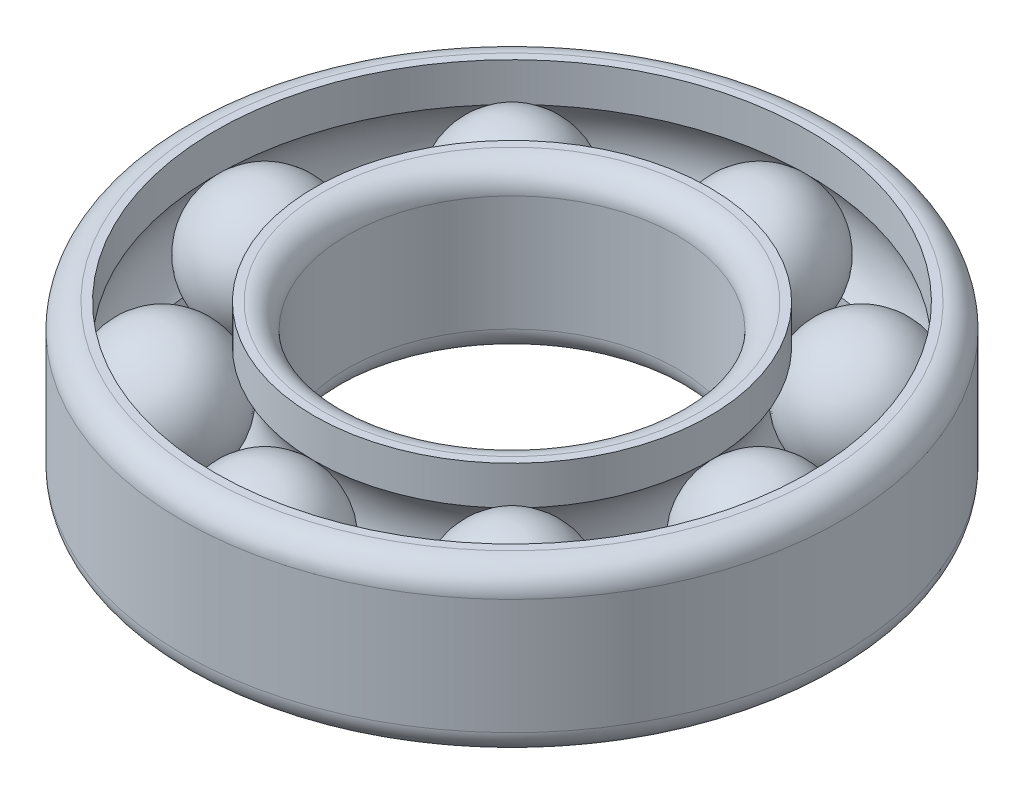
ISO-10303-21;
HEADER;
FILE_DESCRIPTION(('STEP AP214'),'2;1');
FILE_NAME('part.step','',(''),(''),'','','');
FILE_SCHEMA(('AUTOMOTIVE_DESIGN { 1 0 10303 214 1 1 1 1 }'));
ENDSEC;
DATA;
#1=APPLICATION_CONTEXT('core data for automotive mechanical design processes');
#2=APPLICATION_PROTOCOL_DEFINITION('international standard','automotive_design',2000,#1);
#3=PRODUCT_CONTEXT('',#1,'mechanical');
#4=PRODUCT('Part','Part','',(#3));
#5=PRODUCT_RELATED_PRODUCT_CATEGORY('part','',(#4));
#6=PRODUCT_DEFINITION_FORMATION('','',#4);
#7=PRODUCT_DEFINITION_CONTEXT('part definition',#1,'design');
#8=PRODUCT_DEFINITION('design','',#6,#7);
#9=PRODUCT_DEFINITION_SHAPE('','',#8);
#10=(LENGTH_UNIT() NAMED_UNIT(*) SI_UNIT(.MILLI.,.METRE.));
#11=(NAMED_UNIT(*) PLANE_ANGLE_UNIT() SI_UNIT($,.RADIAN.));
#12=(NAMED_UNIT(*) SI_UNIT($,.STERADIAN.) SOLID_ANGLE_UNIT());
#13=UNCERTAINTY_MEASURE_WITH_UNIT(LENGTH_MEASURE(1.E-05),#10,'distance_accuracy_value','');
#14=(GEOMETRIC_REPRESENTATION_CONTEXT(3) GLOBAL_UNCERTAINTY_ASSIGNED_CONTEXT((#13)) GLOBAL_UNIT_ASSIGNED_CONTEXT((#10,
#11,#12)) REPRESENTATION_CONTEXT('',''));
#15=CARTESIAN_POINT('',(0.,0.,0.));
#16=DIRECTION('',(0.,0.,1.));
#17=DIRECTION('',(1.,0.,0.));
#18=AXIS2_PLACEMENT_3D('',#15,#16,#17);
#19=CARTESIAN_POINT('',(-1.06066017177983,0.,1.06066017177981));
#20=DIRECTION('',(0.,1.,0.));
#21=DIRECTION('',(0.707106781186556,0.,-0.707106781186539));
#22=AXIS2_PLACEMENT_3D('',#19,#20,#21);
#23=SPHERICAL_SURFACE('',#22,0.4);
#24=CARTESIAN_POINT('',(-1.06066017177983,0.4,1.06066017177981));
#25=VERTEX_POINT('',#24);
#26=VERTEX_LOOP('',#25);
#27=FACE_BOUND('',#26,.T.);
#28=ADVANCED_FACE('F50',(#27),#23,.T.);
#29=CLOSED_SHELL('',(#28));
#30=MANIFOLD_SOLID_BREP('B2',#29);
#31=CARTESIAN_POINT('',(0.,0.,1.5));
#32=DIRECTION('',(0.,1.,0.));
#33=DIRECTION('',(0.,0.,-1.));
#34=AXIS2_PLACEMENT_3D('',#31,#32,#33);
#35=SPHERICAL_SURFACE('',#34,0.4);
#36=CARTESIAN_POINT('',(0.,0.4,1.5));
#37=VERTEX_POINT('',#36);
#38=VERTEX_LOOP('',#37);
#39=FACE_BOUND('',#38,.T.);
#40=ADVANCED_FACE('F72',(#39),#35,.T.);
#41=CLOSED_SHELL('',(#40));
#42=MANIFOLD_SOLID_BREP('B6',#41);
#43=CARTESIAN_POINT('',(1.06066017177981,0.,1.06066017177983));
#44=DIRECTION('',(0.,1.,0.));
#45=DIRECTION('',(-0.707106781186541,0.,-0.707106781186554));
#46=AXIS2_PLACEMENT_3D('',#43,#44,#45);
#47=SPHERICAL_SURFACE('',#46,0.4);
#48=CARTESIAN_POINT('',(1.06066017177981,0.4,1.06066017177983));
#49=VERTEX_POINT('',#48);
#50=VERTEX_LOOP('',#49);
#51=FACE_BOUND('',#50,.T.);
#52=ADVANCED_FACE('F94',(#51),#47,.T.);
#53=CLOSED_SHELL('',(#52));
#54=MANIFOLD_SOLID_BREP('B46',#53);
#55=CARTESIAN_POINT('',(1.5,0.,0.));
#56=DIRECTION('',(0.,1.,0.));
#57=DIRECTION('',(-1.,0.,0.));
#58=AXIS2_PLACEMENT_3D('',#55,#56,#57);
#59=SPHERICAL_SURFACE('',#58,0.4);
#60=CARTESIAN_POINT('',(1.5,0.4,0.));
#61=VERTEX_POINT('',#60);
#62=VERTEX_LOOP('',#61);
#63=FACE_BOUND('',#62,.T.);
#64=ADVANCED_FACE('F116',(#63),#59,.T.);
#65=CLOSED_SHELL('',(#64));
#66=MANIFOLD_SOLID_BREP('B68',#65);
#67=CARTESIAN_POINT('',(1.06066017177983,0.,-1.06066017177982));
#68=DIRECTION('',(0.,1.,0.));
#69=DIRECTION('',(-0.707106781186551,0.,0.707106781186544));
#70=AXIS2_PLACEMENT_3D('',#67,#68,#69);
#71=SPHERICAL_SURFACE('',#70,0.4);
#72=CARTESIAN_POINT('',(1.06066017177983,0.4,-1.06066017177982));
#73=VERTEX_POINT('',#72);
#74=VERTEX_LOOP('',#73);
#75=FACE_BOUND('',#74,.T.);
#76=ADVANCED_FACE('F138',(#75),#71,.T.);
#77=CLOSED_SHELL('',(#76));
#78=MANIFOLD_SOLID_BREP('B90',#77);
#79=CARTESIAN_POINT('',(0.,0.,-1.5));
#80=DIRECTION('',(0.,1.,0.));
#81=DIRECTION('',(0.,0.,1.));
#82=AXIS2_PLACEMENT_3D('',#79,#80,#81);
#83=SPHERICAL_SURFACE('',#82,0.4);
#84=CARTESIAN_POINT('',(0.,0.4,-1.5));
#85=VERTEX_POINT('',#84);
#86=VERTEX_LOOP('',#85);
#87=FACE_BOUND('',#86,.T.);
#88=ADVANCED_FACE('F160',(#87),#83,.T.);
#89=CLOSED_SHELL('',(#88));
#90=MANIFOLD_SOLID_BREP('B112',#89);
#91=CARTESIAN_POINT('',(-1.06066017177982,0.,-1.06066017177982));
#92=DIRECTION('',(0.,1.,0.));
#93=DIRECTION('',(0.707106781186546,0.,0.707106781186549));
#94=AXIS2_PLACEMENT_3D('',#91,#92,#93);
#95=SPHERICAL_SURFACE('',#94,0.4);
#96=CARTESIAN_POINT('',(-1.06066017177982,0.4,-1.06066017177982));
#97=VERTEX_POINT('',#96);
#98=VERTEX_LOOP('',#97);
#99=FACE_BOUND('',#98,.T.);
#100=ADVANCED_FACE('F184',(#99),#95,.T.);
#101=CLOSED_SHELL('',(#100));
#102=MANIFOLD_SOLID_BREP('B134',#101);
#103=CARTESIAN_POINT('',(0.,0.,0.));
#104=DIRECTION('',(0.,1.,0.));
#105=DIRECTION('',(0.,0.,1.));
#106=AXIS2_PLACEMENT_3D('',#103,#104,#105);
#107=TOROIDAL_SURFACE('',#106,1.5,0.4);
#108=CARTESIAN_POINT('',(0.,0.264575131106459,0.));
#109=DIRECTION('',(0.,1.,0.));
#110=DIRECTION('',(0.,0.,1.));
#111=AXIS2_PLACEMENT_3D('',#108,#109,#110);
#112=CIRCLE('',#111,1.2);
#113=CARTESIAN_POINT('',(0.,0.264575131106459,1.2));
#114=VERTEX_POINT('',#113);
#115=EDGE_CURVE('E237',#114,#114,#112,.T.);
#116=ORIENTED_EDGE('',*,*,#115,.F.);
#117=EDGE_LOOP('',(#116));
#118=FACE_BOUND('',#117,.T.);
#119=CARTESIAN_POINT('',(0.,-0.264575131106459,0.));
#120=DIRECTION('',(0.,1.,0.));
#121=DIRECTION('',(0.,0.,1.));
#122=AXIS2_PLACEMENT_3D('',#119,#120,#121);
#123=CIRCLE('',#122,1.2);
#124=CARTESIAN_POINT('',(0.,-0.264575131106459,1.2));
#125=VERTEX_POINT('',#124);
#126=EDGE_CURVE('E228',#125,#125,#123,.T.);
#127=ORIENTED_EDGE('',*,*,#126,.T.);
#128=EDGE_LOOP('',(#127));
#129=FACE_BOUND('',#128,.T.);
#130=ADVANCED_FACE('F208',(#118,#129),#107,.F.);
#131=CARTESIAN_POINT('',(0.,0.55,0.));
#132=DIRECTION('',(0.,1.,0.));
#133=DIRECTION('',(0.,0.,1.));
#134=AXIS2_PLACEMENT_3D('',#131,#132,#133);
#135=CYLINDRICAL_SURFACE('',#134,1.2);
#136=CARTESIAN_POINT('',(0.,-0.5,0.));
#137=DIRECTION('',(0.,1.,0.));
#138=DIRECTION('',(0.,0.,1.));
#139=AXIS2_PLACEMENT_3D('',#136,#137,#138);
#140=CIRCLE('',#139,1.2);
#141=CARTESIAN_POINT('',(0.,-0.5,1.2));
#142=VERTEX_POINT('',#141);
#143=EDGE_CURVE('E231',#142,#142,#140,.T.);
#144=ORIENTED_EDGE('',*,*,#143,.T.);
#145=EDGE_LOOP('',(#144));
#146=FACE_BOUND('',#145,.T.);
#147=ORIENTED_EDGE('',*,*,#126,.F.);
#148=EDGE_LOOP('',(#147));
#149=FACE_BOUND('',#148,.T.);
#150=ADVANCED_FACE('F246',(#146,#149),#135,.T.);
#151=CARTESIAN_POINT('',(0.,-0.5,0.));
#152=DIRECTION('',(0.,-1.,0.));
#153=DIRECTION('',(0.,0.,-1.));
#154=AXIS2_PLACEMENT_3D('',#151,#152,#153);
#155=PLANE('',#154);
#156=CARTESIAN_POINT('',(0.,-0.5,0.));
#157=DIRECTION('',(0.,-1.,0.));
#158=DIRECTION('',(0.,0.,-1.));
#159=AXIS2_PLACEMENT_3D('',#156,#157,#158);
#160=CIRCLE('',#159,1.15);
#161=CARTESIAN_POINT('',(0.,-0.5,-1.15));
#162=VERTEX_POINT('',#161);
#163=EDGE_CURVE('E223',#162,#162,#160,.F.);
#164=ORIENTED_EDGE('',*,*,#163,.T.);
#165=EDGE_LOOP('',(#164));
#166=FACE_BOUND('',#165,.T.);
#167=ORIENTED_EDGE('',*,*,#143,.F.);
#168=EDGE_LOOP('',(#167));
#169=FACE_BOUND('',#168,.T.);
#170=ADVANCED_FACE('F251',(#166,#169),#155,.T.);
#171=CARTESIAN_POINT('',(0.,0.55,0.));
#172=DIRECTION('',(0.,1.,0.));
#173=DIRECTION('',(0.,0.,1.));
#174=AXIS2_PLACEMENT_3D('',#171,#172,#173);
#175=CYLINDRICAL_SURFACE('',#174,1.);
#176=CARTESIAN_POINT('',(0.,-0.35,0.));
#177=DIRECTION('',(0.,-1.,0.));
#178=DIRECTION('',(0.,0.,-1.));
#179=AXIS2_PLACEMENT_3D('',#176,#177,#178);
#180=CIRCLE('',#179,1.);
#181=CARTESIAN_POINT('',(0.,-0.35,-1.));
#182=VERTEX_POINT('',#181);
#183=EDGE_CURVE('E215',#182,#182,#180,.T.);
#184=ORIENTED_EDGE('',*,*,#183,.T.);
#185=EDGE_LOOP('',(#184));
#186=FACE_BOUND('',#185,.T.);
#187=CARTESIAN_POINT('',(0.,0.35,0.));
#188=DIRECTION('',(0.,-1.,0.));
#189=DIRECTION('',(0.,0.,-1.));
#190=AXIS2_PLACEMENT_3D('',#187,#188,#189);
#191=CIRCLE('',#190,1.);
#192=CARTESIAN_POINT('',(0.,0.35,-1.));
#193=VERTEX_POINT('',#192);
#194=EDGE_CURVE('E219',#193,#193,#191,.F.);
#195=ORIENTED_EDGE('',*,*,#194,.T.);
#196=EDGE_LOOP('',(#195));
#197=FACE_BOUND('',#196,.T.);
#198=ADVANCED_FACE('F258',(#186,#197),#175,.F.);
#199=CARTESIAN_POINT('',(0.,0.5,0.));
#200=DIRECTION('',(0.,-1.,0.));
#201=DIRECTION('',(0.,0.,-1.));
#202=AXIS2_PLACEMENT_3D('',#199,#200,#201);
#203=PLANE('',#202);
#204=CARTESIAN_POINT('',(0.,0.5,0.));
#205=DIRECTION('',(0.,-1.,0.));
#206=DIRECTION('',(0.,0.,-1.));
#207=AXIS2_PLACEMENT_3D('',#204,#205,#206);
#208=CIRCLE('',#207,1.15);
#209=CARTESIAN_POINT('',(0.,0.5,-1.15));
#210=VERTEX_POINT('',#209);
#211=EDGE_CURVE('E183',#210,#210,#208,.T.);
#212=ORIENTED_EDGE('',*,*,#211,.T.);
#213=EDGE_LOOP('',(#212));
#214=FACE_BOUND('',#213,.T.);
#215=CARTESIAN_POINT('',(0.,0.5,0.));
#216=DIRECTION('',(0.,1.,0.));
#217=DIRECTION('',(0.,0.,1.));
#218=AXIS2_PLACEMENT_3D('',#215,#216,#217);
#219=CIRCLE('',#218,1.2);
#220=CARTESIAN_POINT('',(0.,0.5,1.2));
#221=VERTEX_POINT('',#220);
#222=EDGE_CURVE('E234',#221,#221,#219,.T.);
#223=ORIENTED_EDGE('',*,*,#222,.T.);
#224=EDGE_LOOP('',(#223));
#225=FACE_BOUND('',#224,.T.);
#226=ADVANCED_FACE('F270',(#214,#225),#203,.F.);
#227=CARTESIAN_POINT('',(0.,0.55,0.));
#228=DIRECTION('',(0.,1.,0.));
#229=DIRECTION('',(0.,0.,1.));
#230=AXIS2_PLACEMENT_3D('',#227,#228,#229);
#231=CYLINDRICAL_SURFACE('',#230,1.2);
#232=ORIENTED_EDGE('',*,*,#115,.T.);
#233=EDGE_LOOP('',(#232));
#234=FACE_BOUND('',#233,.T.);
#235=ORIENTED_EDGE('',*,*,#222,.F.);
#236=EDGE_LOOP('',(#235));
#237=FACE_BOUND('',#236,.T.);
#238=ADVANCED_FACE('F241',(#234,#237),#231,.T.);
#239=CARTESIAN_POINT('',(0.,-0.35,0.));
#240=DIRECTION('',(0.,-1.,0.));
#241=DIRECTION('',(0.,0.,-1.));
#242=AXIS2_PLACEMENT_3D('',#239,#240,#241);
#243=TOROIDAL_SURFACE('',#242,1.15,0.15);
#244=ORIENTED_EDGE('',*,*,#183,.F.);
#245=EDGE_LOOP('',(#244));
#246=FACE_BOUND('',#245,.T.);
#247=ORIENTED_EDGE('',*,*,#163,.F.);
#248=EDGE_LOOP('',(#247));
#249=FACE_BOUND('',#248,.T.);
#250=ADVANCED_FACE('F262',(#246,#249),#243,.T.);
#251=CARTESIAN_POINT('',(0.,0.35,0.));
#252=DIRECTION('',(0.,-1.,0.));
#253=DIRECTION('',(0.,0.,-1.));
#254=AXIS2_PLACEMENT_3D('',#251,#252,#253);
#255=TOROIDAL_SURFACE('',#254,1.15,0.15);
#256=ORIENTED_EDGE('',*,*,#211,.F.);
#257=EDGE_LOOP('',(#256));
#258=FACE_BOUND('',#257,.T.);
#259=ORIENTED_EDGE('',*,*,#194,.F.);
#260=EDGE_LOOP('',(#259));
#261=FACE_BOUND('',#260,.T.);
#262=ADVANCED_FACE('F210',(#258,#261),#255,.T.);
#263=CLOSED_SHELL('',(#130,#150,#170,#198,#226,#238,#250,#262));
#264=MANIFOLD_SOLID_BREP('B156',#263);
#265=CARTESIAN_POINT('',(0.,0.,0.));
#266=DIRECTION('',(0.,1.,0.));
#267=DIRECTION('',(0.,0.,1.));
#268=AXIS2_PLACEMENT_3D('',#265,#266,#267);
#269=TOROIDAL_SURFACE('',#268,1.5,0.4);
#270=CARTESIAN_POINT('',(0.,-0.264575131106459,0.));
#271=DIRECTION('',(0.,1.,0.));
#272=DIRECTION('',(0.,0.,1.));
#273=AXIS2_PLACEMENT_3D('',#270,#271,#272);
#274=CIRCLE('',#273,1.8);
#275=CARTESIAN_POINT('',(0.,-0.264575131106459,1.8));
#276=VERTEX_POINT('',#275);
#277=EDGE_CURVE('E374',#276,#276,#274,.T.);
#278=ORIENTED_EDGE('',*,*,#277,.F.);
#279=EDGE_LOOP('',(#278));
#280=FACE_BOUND('',#279,.T.);
#281=CARTESIAN_POINT('',(0.,0.264575131106459,0.));
#282=DIRECTION('',(0.,1.,0.));
#283=DIRECTION('',(0.,0.,1.));
#284=AXIS2_PLACEMENT_3D('',#281,#282,#283);
#285=CIRCLE('',#284,1.8);
#286=CARTESIAN_POINT('',(0.,0.264575131106459,1.8));
#287=VERTEX_POINT('',#286);
#288=EDGE_CURVE('E362',#287,#287,#285,.T.);
#289=ORIENTED_EDGE('',*,*,#288,.T.);
#290=EDGE_LOOP('',(#289));
#291=FACE_BOUND('',#290,.T.);
#292=ADVANCED_FACE('F338',(#280,#291),#269,.F.);
#293=CARTESIAN_POINT('',(0.,0.55,0.));
#294=DIRECTION('',(0.,1.,0.));
#295=DIRECTION('',(0.,0.,1.));
#296=AXIS2_PLACEMENT_3D('',#293,#294,#295);
#297=CYLINDRICAL_SURFACE('',#296,1.8);
#298=ORIENTED_EDGE('',*,*,#288,.F.);
#299=EDGE_LOOP('',(#298));
#300=FACE_BOUND('',#299,.T.);
#301=CARTESIAN_POINT('',(0.,0.5,0.));
#302=DIRECTION('',(0.,1.,0.));
#303=DIRECTION('',(0.,0.,1.));
#304=AXIS2_PLACEMENT_3D('',#301,#302,#303);
#305=CIRCLE('',#304,1.8);
#306=CARTESIAN_POINT('',(0.,0.5,1.8));
#307=VERTEX_POINT('',#306);
#308=EDGE_CURVE('E366',#307,#307,#305,.T.);
#309=ORIENTED_EDGE('',*,*,#308,.T.);
#310=EDGE_LOOP('',(#309));
#311=FACE_BOUND('',#310,.T.);
#312=ADVANCED_FACE('F383',(#300,#311),#297,.F.);
#313=CARTESIAN_POINT('',(0.,0.5,0.));
#314=DIRECTION('',(0.,-1.,0.));
#315=DIRECTION('',(0.,0.,-1.));
#316=AXIS2_PLACEMENT_3D('',#313,#314,#315);
#317=PLANE('',#316);
#318=CARTESIAN_POINT('',(0.,0.5,0.));
#319=DIRECTION('',(0.,-1.,0.));
#320=DIRECTION('',(0.,0.,-1.));
#321=AXIS2_PLACEMENT_3D('',#318,#319,#320);
#322=CIRCLE('',#321,1.85);
#323=CARTESIAN_POINT('',(0.,0.5,-1.85));
#324=VERTEX_POINT('',#323);
#325=EDGE_CURVE('E207',#324,#324,#322,.F.);
#326=ORIENTED_EDGE('',*,*,#325,.T.);
#327=EDGE_LOOP('',(#326));
#328=FACE_BOUND('',#327,.T.);
#329=ORIENTED_EDGE('',*,*,#308,.F.);
#330=EDGE_LOOP('',(#329));
#331=FACE_BOUND('',#330,.T.);
#332=ADVANCED_FACE('F389',(#328,#331),#317,.F.);
#333=CARTESIAN_POINT('',(0.,0.55,0.));
#334=DIRECTION('',(0.,1.,0.));
#335=DIRECTION('',(0.,0.,1.));
#336=AXIS2_PLACEMENT_3D('',#333,#334,#335);
#337=CYLINDRICAL_SURFACE('',#336,2.);
#338=CARTESIAN_POINT('',(0.,-0.35,0.));
#339=DIRECTION('',(0.,-1.,0.));
#340=DIRECTION('',(0.,0.,-1.));
#341=AXIS2_PLACEMENT_3D('',#338,#339,#340);
#342=CIRCLE('',#341,2.);
#343=CARTESIAN_POINT('',(0.,-0.35,-2.));
#344=VERTEX_POINT('',#343);
#345=EDGE_CURVE('E351',#344,#344,#342,.F.);
#346=ORIENTED_EDGE('',*,*,#345,.T.);
#347=EDGE_LOOP('',(#346));
#348=FACE_BOUND('',#347,.T.);
#349=CARTESIAN_POINT('',(0.,0.35,0.));
#350=DIRECTION('',(0.,-1.,0.));
#351=DIRECTION('',(0.,0.,-1.));
#352=AXIS2_PLACEMENT_3D('',#349,#350,#351);
#353=CIRCLE('',#352,2.);
#354=CARTESIAN_POINT('',(0.,0.35,-2.));
#355=VERTEX_POINT('',#354);
#356=EDGE_CURVE('E356',#355,#355,#353,.T.);
#357=ORIENTED_EDGE('',*,*,#356,.T.);
#358=EDGE_LOOP('',(#357));
#359=FACE_BOUND('',#358,.T.);
#360=ADVANCED_FACE('F394',(#348,#359),#337,.T.);
#361=CARTESIAN_POINT('',(0.,-0.5,0.));
#362=DIRECTION('',(0.,-1.,0.));
#363=DIRECTION('',(0.,0.,-1.));
#364=AXIS2_PLACEMENT_3D('',#361,#362,#363);
#365=PLANE('',#364);
#366=CARTESIAN_POINT('',(0.,-0.5,0.));
#367=DIRECTION('',(0.,-1.,0.));
#368=DIRECTION('',(0.,0.,-1.));
#369=AXIS2_PLACEMENT_3D('',#366,#367,#368);
#370=CIRCLE('',#369,1.85);
#371=CARTESIAN_POINT('',(0.,-0.5,-1.85));
#372=VERTEX_POINT('',#371);
#373=EDGE_CURVE('E346',#372,#372,#370,.T.);
#374=ORIENTED_EDGE('',*,*,#373,.T.);
#375=EDGE_LOOP('',(#374));
#376=FACE_BOUND('',#375,.T.);
#377=CARTESIAN_POINT('',(0.,-0.500000000000001,0.));
#378=DIRECTION('',(0.,1.,0.));
#379=DIRECTION('',(0.,0.,1.));
#380=AXIS2_PLACEMENT_3D('',#377,#378,#379);
#381=CIRCLE('',#380,1.8);
#382=CARTESIAN_POINT('',(0.,-0.500000000000001,1.8));
#383=VERTEX_POINT('',#382);
#384=EDGE_CURVE('E370',#383,#383,#381,.T.);
#385=ORIENTED_EDGE('',*,*,#384,.T.);
#386=EDGE_LOOP('',(#385));
#387=FACE_BOUND('',#386,.T.);
#388=ADVANCED_FACE('F400',(#376,#387),#365,.T.);
#389=CARTESIAN_POINT('',(0.,0.55,0.));
#390=DIRECTION('',(0.,1.,0.));
#391=DIRECTION('',(0.,0.,1.));
#392=AXIS2_PLACEMENT_3D('',#389,#390,#391);
#393=CYLINDRICAL_SURFACE('',#392,1.8);
#394=ORIENTED_EDGE('',*,*,#384,.F.);
#395=EDGE_LOOP('',(#394));
#396=FACE_BOUND('',#395,.T.);
#397=ORIENTED_EDGE('',*,*,#277,.T.);
#398=EDGE_LOOP('',(#397));
#399=FACE_BOUND('',#398,.T.);
#400=ADVANCED_FACE('F379',(#396,#399),#393,.F.);
#401=CARTESIAN_POINT('',(0.,-0.35,0.));
#402=DIRECTION('',(0.,-1.,0.));
#403=DIRECTION('',(0.,0.,-1.));
#404=AXIS2_PLACEMENT_3D('',#401,#402,#403);
#405=TOROIDAL_SURFACE('',#404,1.85,0.15);
#406=ORIENTED_EDGE('',*,*,#373,.F.);
#407=EDGE_LOOP('',(#406));
#408=FACE_BOUND('',#407,.T.);
#409=ORIENTED_EDGE('',*,*,#345,.F.);
#410=EDGE_LOOP('',(#409));
#411=FACE_BOUND('',#410,.T.);
#412=ADVANCED_FACE('F404',(#408,#411),#405,.T.);
#413=CARTESIAN_POINT('',(0.,0.35,0.));
#414=DIRECTION('',(0.,-1.,0.));
#415=DIRECTION('',(0.,0.,-1.));
#416=AXIS2_PLACEMENT_3D('',#413,#414,#415);
#417=TOROIDAL_SURFACE('',#416,1.85,0.15);
#418=ORIENTED_EDGE('',*,*,#356,.F.);
#419=EDGE_LOOP('',(#418));
#420=FACE_BOUND('',#419,.T.);
#421=ORIENTED_EDGE('',*,*,#325,.F.);
#422=EDGE_LOOP('',(#421));
#423=FACE_BOUND('',#422,.T.);
#424=ADVANCED_FACE('F340',(#420,#423),#417,.T.);
#425=CLOSED_SHELL('',(#292,#312,#332,#360,#388,#400,#412,#424));
#426=MANIFOLD_SOLID_BREP('B178',#425);
#427=CARTESIAN_POINT('',(-1.5,0.,0.));
#428=DIRECTION('',(0.,1.,0.));
#429=DIRECTION('',(1.,0.,0.));
#430=AXIS2_PLACEMENT_3D('',#427,#428,#429);
#431=SPHERICAL_SURFACE('',#430,0.4);
#432=CARTESIAN_POINT('',(-1.5,0.4,0.));
#433=VERTEX_POINT('',#432);
#434=VERTEX_LOOP('',#433);
#435=FACE_BOUND('',#434,.T.);
#436=ADVANCED_FACE('F468',(#435),#431,.T.);
#437=CLOSED_SHELL('',(#436));
#438=MANIFOLD_SOLID_BREP('B202',#437);
#439=ADVANCED_BREP_SHAPE_REPRESENTATION('',(#18,#30,#42,#54,#66,#78,#90,#102,#264,#426,#438),#14);
#440=SHAPE_DEFINITION_REPRESENTATION(#9,#439);
ENDSEC;
END-ISO-10303-21;
